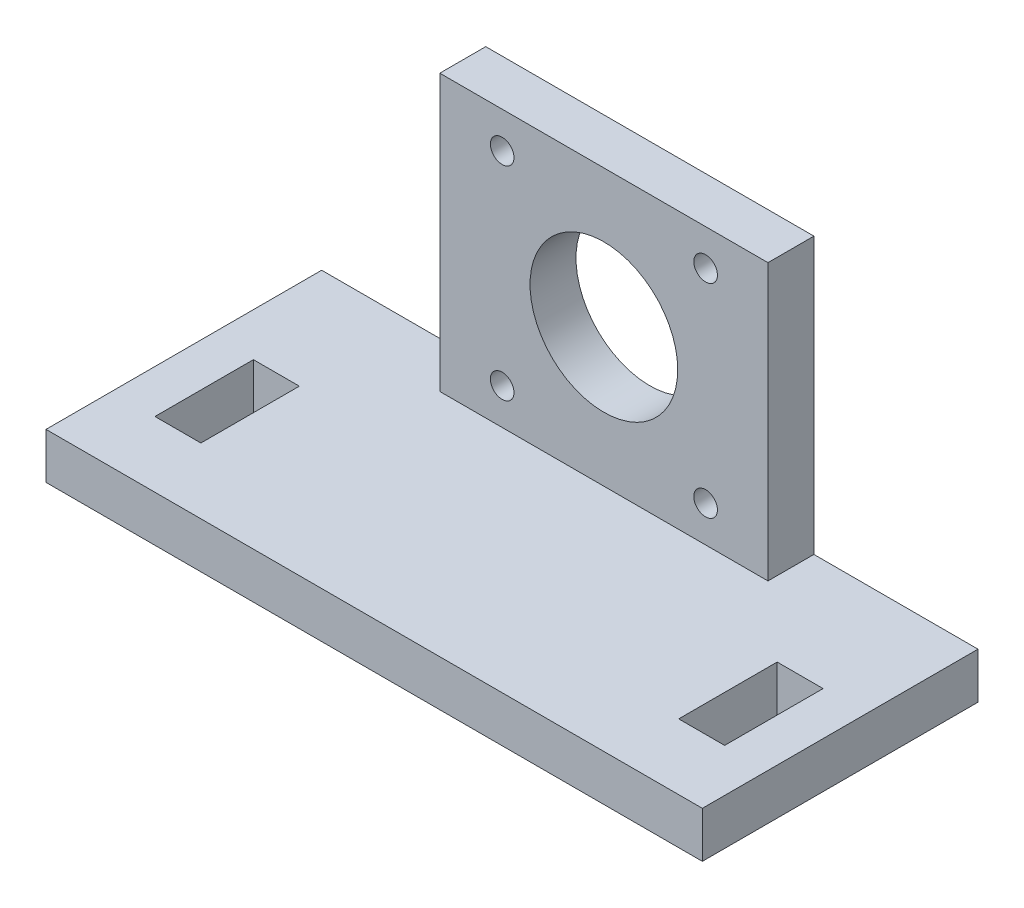
ISO-10303-21;
HEADER;
FILE_DESCRIPTION(('STEP AP214'),'2;1');
FILE_NAME('part.step','',(''),(''),'','','');
FILE_SCHEMA(('AUTOMOTIVE_DESIGN { 1 0 10303 214 1 1 1 1 }'));
ENDSEC;
DATA;
#1=APPLICATION_CONTEXT('core data for automotive mechanical design processes');
#2=APPLICATION_PROTOCOL_DEFINITION('international standard','automotive_design',2000,#1);
#3=PRODUCT_CONTEXT('',#1,'mechanical');
#4=PRODUCT('Part','Part','',(#3));
#5=PRODUCT_RELATED_PRODUCT_CATEGORY('part','',(#4));
#6=PRODUCT_DEFINITION_FORMATION('','',#4);
#7=PRODUCT_DEFINITION_CONTEXT('part definition',#1,'design');
#8=PRODUCT_DEFINITION('design','',#6,#7);
#9=PRODUCT_DEFINITION_SHAPE('','',#8);
#10=(LENGTH_UNIT() NAMED_UNIT(*) SI_UNIT(.MILLI.,.METRE.));
#11=(NAMED_UNIT(*) PLANE_ANGLE_UNIT() SI_UNIT($,.RADIAN.));
#12=(NAMED_UNIT(*) SI_UNIT($,.STERADIAN.) SOLID_ANGLE_UNIT());
#13=UNCERTAINTY_MEASURE_WITH_UNIT(LENGTH_MEASURE(1.E-05),#10,'distance_accuracy_value','');
#14=(GEOMETRIC_REPRESENTATION_CONTEXT(3) GLOBAL_UNCERTAINTY_ASSIGNED_CONTEXT((#13)) GLOBAL_UNIT_ASSIGNED_CONTEXT((#10,
#11,#12)) REPRESENTATION_CONTEXT('',''));
#15=CARTESIAN_POINT('',(0.,0.,0.));
#16=DIRECTION('',(0.,0.,1.));
#17=DIRECTION('',(1.,0.,0.));
#18=AXIS2_PLACEMENT_3D('',#15,#16,#17);
#19=CARTESIAN_POINT('',(-25.,49.,21.));
#20=DIRECTION('',(1.,0.,0.));
#21=DIRECTION('',(0.,0.,-1.));
#22=AXIS2_PLACEMENT_3D('',#19,#20,#21);
#23=PLANE('',#22);
#24=DIRECTION('',(0.,0.,-1.));
#25=VECTOR('',#24,1.);
#26=CARTESIAN_POINT('',(-25.,7.,21.));
#27=LINE('',#26,#25);
#28=CARTESIAN_POINT('',(-25.,7.,-14.));
#29=VERTEX_POINT('',#28);
#30=CARTESIAN_POINT('',(-25.,7.,-21.));
#31=VERTEX_POINT('',#30);
#32=EDGE_CURVE('E11',#29,#31,#27,.T.);
#33=ORIENTED_EDGE('',*,*,#32,.F.);
#34=DIRECTION('',(0.,1.,0.));
#35=VECTOR('',#34,1.);
#36=CARTESIAN_POINT('',(-25.,7.,-14.));
#37=LINE('',#36,#35);
#38=CARTESIAN_POINT('',(-25.,49.,-14.));
#39=VERTEX_POINT('',#38);
#40=EDGE_CURVE('E270',#29,#39,#37,.T.);
#41=ORIENTED_EDGE('',*,*,#40,.T.);
#42=DIRECTION('',(0.,0.,1.));
#43=VECTOR('',#42,1.);
#44=CARTESIAN_POINT('',(-25.,49.,21.));
#45=LINE('',#44,#43);
#46=CARTESIAN_POINT('',(-25.,49.,-21.));
#47=VERTEX_POINT('',#46);
#48=EDGE_CURVE('E320',#47,#39,#45,.T.);
#49=ORIENTED_EDGE('',*,*,#48,.F.);
#50=DIRECTION('',(0.,-1.,0.));
#51=VECTOR('',#50,1.);
#52=CARTESIAN_POINT('',(-25.,49.,-21.));
#53=LINE('',#52,#51);
#54=EDGE_CURVE('E263',#47,#31,#53,.T.);
#55=ORIENTED_EDGE('',*,*,#54,.T.);
#56=EDGE_LOOP('',(#33,#41,#49,#55));
#57=FACE_BOUND('',#56,.T.);
#58=ADVANCED_FACE('F32',(#57),#23,.F.);
#59=CARTESIAN_POINT('',(25.,49.,21.));
#60=DIRECTION('',(-1.,0.,0.));
#61=DIRECTION('',(0.,0.,1.));
#62=AXIS2_PLACEMENT_3D('',#59,#60,#61);
#63=PLANE('',#62);
#64=DIRECTION('',(0.,0.,1.));
#65=VECTOR('',#64,1.);
#66=CARTESIAN_POINT('',(25.,7.,21.));
#67=LINE('',#66,#65);
#68=CARTESIAN_POINT('',(25.,7.,-21.));
#69=VERTEX_POINT('',#68);
#70=CARTESIAN_POINT('',(25.,7.,-14.));
#71=VERTEX_POINT('',#70);
#72=EDGE_CURVE('E268',#69,#71,#67,.T.);
#73=ORIENTED_EDGE('',*,*,#72,.F.);
#74=DIRECTION('',(0.,-1.,0.));
#75=VECTOR('',#74,1.);
#76=CARTESIAN_POINT('',(25.,49.,-21.));
#77=LINE('',#76,#75);
#78=CARTESIAN_POINT('',(25.,49.,-21.));
#79=VERTEX_POINT('',#78);
#80=EDGE_CURVE('E41',#79,#69,#77,.T.);
#81=ORIENTED_EDGE('',*,*,#80,.F.);
#82=DIRECTION('',(0.,0.,-1.));
#83=VECTOR('',#82,1.);
#84=CARTESIAN_POINT('',(25.,49.,21.));
#85=LINE('',#84,#83);
#86=CARTESIAN_POINT('',(25.,49.,-14.));
#87=VERTEX_POINT('',#86);
#88=EDGE_CURVE('E316',#87,#79,#85,.T.);
#89=ORIENTED_EDGE('',*,*,#88,.F.);
#90=DIRECTION('',(0.,1.,0.));
#91=VECTOR('',#90,1.);
#92=CARTESIAN_POINT('',(25.,7.,-14.));
#93=LINE('',#92,#91);
#94=EDGE_CURVE('E273',#71,#87,#93,.T.);
#95=ORIENTED_EDGE('',*,*,#94,.F.);
#96=EDGE_LOOP('',(#73,#81,#89,#95));
#97=FACE_BOUND('',#96,.T.);
#98=ADVANCED_FACE('F34',(#97),#63,.F.);
#99=CARTESIAN_POINT('',(-25.,49.,-21.));
#100=DIRECTION('',(0.,0.,1.));
#101=DIRECTION('',(1.,0.,0.));
#102=AXIS2_PLACEMENT_3D('',#99,#100,#101);
#103=PLANE('',#102);
#104=CARTESIAN_POINT('',(15.5000000000003,12.5,-21.));
#105=DIRECTION('',(0.,0.,1.));
#106=DIRECTION('',(1.,0.,0.));
#107=AXIS2_PLACEMENT_3D('',#104,#105,#106);
#108=CIRCLE('',#107,1.8);
#109=CARTESIAN_POINT('',(17.3000000000003,12.5,-21.));
#110=VERTEX_POINT('',#109);
#111=EDGE_CURVE('E218',#110,#110,#108,.T.);
#112=ORIENTED_EDGE('',*,*,#111,.T.);
#113=EDGE_LOOP('',(#112));
#114=FACE_BOUND('',#113,.T.);
#115=CARTESIAN_POINT('',(-15.4999999999997,12.5,-21.));
#116=DIRECTION('',(0.,0.,1.));
#117=DIRECTION('',(1.,0.,0.));
#118=AXIS2_PLACEMENT_3D('',#115,#116,#117);
#119=CIRCLE('',#118,1.8);
#120=CARTESIAN_POINT('',(-13.6999999999997,12.5,-21.));
#121=VERTEX_POINT('',#120);
#122=EDGE_CURVE('E224',#121,#121,#119,.T.);
#123=ORIENTED_EDGE('',*,*,#122,.T.);
#124=EDGE_LOOP('',(#123));
#125=FACE_BOUND('',#124,.T.);
#126=CARTESIAN_POINT('',(15.5,43.5,-21.));
#127=DIRECTION('',(0.,0.,1.));
#128=DIRECTION('',(1.,0.,0.));
#129=AXIS2_PLACEMENT_3D('',#126,#127,#128);
#130=CIRCLE('',#129,1.8);
#131=CARTESIAN_POINT('',(17.3,43.5,-21.));
#132=VERTEX_POINT('',#131);
#133=EDGE_CURVE('E230',#132,#132,#130,.T.);
#134=ORIENTED_EDGE('',*,*,#133,.T.);
#135=EDGE_LOOP('',(#134));
#136=FACE_BOUND('',#135,.T.);
#137=CARTESIAN_POINT('',(-15.5,43.5,-21.));
#138=DIRECTION('',(0.,0.,1.));
#139=DIRECTION('',(1.,0.,0.));
#140=AXIS2_PLACEMENT_3D('',#137,#138,#139);
#141=CIRCLE('',#140,1.8);
#142=CARTESIAN_POINT('',(-13.7,43.5,-21.));
#143=VERTEX_POINT('',#142);
#144=EDGE_CURVE('E236',#143,#143,#141,.T.);
#145=ORIENTED_EDGE('',*,*,#144,.T.);
#146=EDGE_LOOP('',(#145));
#147=FACE_BOUND('',#146,.T.);
#148=CARTESIAN_POINT('',(0.,28.,-21.));
#149=DIRECTION('',(0.,0.,1.));
#150=DIRECTION('',(1.,0.,0.));
#151=AXIS2_PLACEMENT_3D('',#148,#149,#150);
#152=CIRCLE('',#151,11.25);
#153=CARTESIAN_POINT('',(11.25,28.,-21.));
#154=VERTEX_POINT('',#153);
#155=EDGE_CURVE('E242',#154,#154,#152,.T.);
#156=ORIENTED_EDGE('',*,*,#155,.T.);
#157=EDGE_LOOP('',(#156));
#158=FACE_BOUND('',#157,.T.);
#159=DIRECTION('',(-1.,0.,0.));
#160=VECTOR('',#159,1.);
#161=CARTESIAN_POINT('',(-25.,0.,-21.));
#162=LINE('',#161,#160);
#163=CARTESIAN_POINT('',(50.,0.,-21.));
#164=VERTEX_POINT('',#163);
#165=CARTESIAN_POINT('',(-50.,0.,-21.));
#166=VERTEX_POINT('',#165);
#167=EDGE_CURVE('E272',#164,#166,#162,.T.);
#168=ORIENTED_EDGE('',*,*,#167,.T.);
#169=DIRECTION('',(0.,-1.,0.));
#170=VECTOR('',#169,1.);
#171=CARTESIAN_POINT('',(-50.,7.,-21.));
#172=LINE('',#171,#170);
#173=CARTESIAN_POINT('',(-50.,7.,-21.));
#174=VERTEX_POINT('',#173);
#175=EDGE_CURVE('E250',#174,#166,#172,.T.);
#176=ORIENTED_EDGE('',*,*,#175,.F.);
#177=DIRECTION('',(1.,0.,0.));
#178=VECTOR('',#177,1.);
#179=CARTESIAN_POINT('',(-50.,7.,-21.));
#180=LINE('',#179,#178);
#181=EDGE_CURVE('E256',#174,#31,#180,.T.);
#182=ORIENTED_EDGE('',*,*,#181,.T.);
#183=ORIENTED_EDGE('',*,*,#54,.F.);
#184=DIRECTION('',(-1.,0.,0.));
#185=VECTOR('',#184,1.);
#186=CARTESIAN_POINT('',(-25.,49.,-21.));
#187=LINE('',#186,#185);
#188=EDGE_CURVE('E318',#79,#47,#187,.T.);
#189=ORIENTED_EDGE('',*,*,#188,.F.);
#190=ORIENTED_EDGE('',*,*,#80,.T.);
#191=DIRECTION('',(-1.,0.,0.));
#192=VECTOR('',#191,1.);
#193=CARTESIAN_POINT('',(50.,7.,-21.));
#194=LINE('',#193,#192);
#195=CARTESIAN_POINT('',(50.,7.,-21.));
#196=VERTEX_POINT('',#195);
#197=EDGE_CURVE('E294',#196,#69,#194,.T.);
#198=ORIENTED_EDGE('',*,*,#197,.F.);
#199=DIRECTION('',(0.,1.,0.));
#200=VECTOR('',#199,1.);
#201=CARTESIAN_POINT('',(50.,0.,-21.));
#202=LINE('',#201,#200);
#203=EDGE_CURVE('E304',#164,#196,#202,.T.);
#204=ORIENTED_EDGE('',*,*,#203,.F.);
#205=EDGE_LOOP('',(#168,#176,#182,#183,#189,#190,#198,#204));
#206=FACE_BOUND('',#205,.T.);
#207=ADVANCED_FACE('F335',(#114,#125,#136,#147,#158,#206),#103,.F.);
#208=CARTESIAN_POINT('',(-25.,49.,21.));
#209=DIRECTION('',(0.,0.,-1.));
#210=DIRECTION('',(-1.,0.,0.));
#211=AXIS2_PLACEMENT_3D('',#208,#209,#210);
#212=PLANE('',#211);
#213=DIRECTION('',(1.,0.,0.));
#214=VECTOR('',#213,1.);
#215=CARTESIAN_POINT('',(-25.,0.,21.));
#216=LINE('',#215,#214);
#217=CARTESIAN_POINT('',(-50.,0.,21.));
#218=VERTEX_POINT('',#217);
#219=CARTESIAN_POINT('',(50.,0.,21.));
#220=VERTEX_POINT('',#219);
#221=EDGE_CURVE('E278',#218,#220,#216,.T.);
#222=ORIENTED_EDGE('',*,*,#221,.T.);
#223=DIRECTION('',(0.,-1.,0.));
#224=VECTOR('',#223,1.);
#225=CARTESIAN_POINT('',(50.,0.,21.));
#226=LINE('',#225,#224);
#227=CARTESIAN_POINT('',(50.,7.,21.));
#228=VERTEX_POINT('',#227);
#229=EDGE_CURVE('E259',#228,#220,#226,.T.);
#230=ORIENTED_EDGE('',*,*,#229,.F.);
#231=DIRECTION('',(1.,0.,0.));
#232=VECTOR('',#231,1.);
#233=CARTESIAN_POINT('',(-25.,7.,21.));
#234=LINE('',#233,#232);
#235=CARTESIAN_POINT('',(-50.,7.,21.));
#236=VERTEX_POINT('',#235);
#237=EDGE_CURVE('E287',#236,#228,#234,.T.);
#238=ORIENTED_EDGE('',*,*,#237,.F.);
#239=DIRECTION('',(0.,1.,0.));
#240=VECTOR('',#239,1.);
#241=CARTESIAN_POINT('',(-50.,7.,21.));
#242=LINE('',#241,#240);
#243=EDGE_CURVE('E245',#218,#236,#242,.T.);
#244=ORIENTED_EDGE('',*,*,#243,.F.);
#245=EDGE_LOOP('',(#222,#230,#238,#244));
#246=FACE_BOUND('',#245,.T.);
#247=ADVANCED_FACE('F345',(#246),#212,.F.);
#248=CARTESIAN_POINT('',(0.,49.,0.));
#249=DIRECTION('',(0.,-1.,0.));
#250=DIRECTION('',(0.,0.,-1.));
#251=AXIS2_PLACEMENT_3D('',#248,#249,#250);
#252=PLANE('',#251);
#253=ORIENTED_EDGE('',*,*,#48,.T.);
#254=DIRECTION('',(-1.,0.,0.));
#255=VECTOR('',#254,1.);
#256=CARTESIAN_POINT('',(-25.,49.,-14.));
#257=LINE('',#256,#255);
#258=EDGE_CURVE('E295',#87,#39,#257,.T.);
#259=ORIENTED_EDGE('',*,*,#258,.F.);
#260=ORIENTED_EDGE('',*,*,#88,.T.);
#261=ORIENTED_EDGE('',*,*,#188,.T.);
#262=EDGE_LOOP('',(#253,#259,#260,#261));
#263=FACE_BOUND('',#262,.T.);
#264=ADVANCED_FACE('F371',(#263),#252,.F.);
#265=CARTESIAN_POINT('',(0.,0.,0.));
#266=DIRECTION('',(0.,-1.,0.));
#267=DIRECTION('',(0.,0.,-1.));
#268=AXIS2_PLACEMENT_3D('',#265,#266,#267);
#269=PLANE('',#268);
#270=DIRECTION('',(0.,0.,1.));
#271=VECTOR('',#270,1.);
#272=CARTESIAN_POINT('',(36.4,0.,11.));
#273=LINE('',#272,#271);
#274=CARTESIAN_POINT('',(36.4,0.,-4.));
#275=VERTEX_POINT('',#274);
#276=CARTESIAN_POINT('',(36.4,0.,11.));
#277=VERTEX_POINT('',#276);
#278=EDGE_CURVE('E149',#275,#277,#273,.T.);
#279=ORIENTED_EDGE('',*,*,#278,.T.);
#280=DIRECTION('',(1.,0.,0.));
#281=VECTOR('',#280,1.);
#282=CARTESIAN_POINT('',(36.4,0.,11.));
#283=LINE('',#282,#281);
#284=CARTESIAN_POINT('',(43.4,0.,11.));
#285=VERTEX_POINT('',#284);
#286=EDGE_CURVE('E158',#277,#285,#283,.T.);
#287=ORIENTED_EDGE('',*,*,#286,.T.);
#288=DIRECTION('',(0.,0.,-1.));
#289=VECTOR('',#288,1.);
#290=CARTESIAN_POINT('',(43.4,0.,11.));
#291=LINE('',#290,#289);
#292=CARTESIAN_POINT('',(43.4,0.,-4.));
#293=VERTEX_POINT('',#292);
#294=EDGE_CURVE('E49',#285,#293,#291,.T.);
#295=ORIENTED_EDGE('',*,*,#294,.T.);
#296=DIRECTION('',(-1.,0.,0.));
#297=VECTOR('',#296,1.);
#298=CARTESIAN_POINT('',(36.4,0.,-4.));
#299=LINE('',#298,#297);
#300=EDGE_CURVE('E155',#293,#275,#299,.T.);
#301=ORIENTED_EDGE('',*,*,#300,.T.);
#302=EDGE_LOOP('',(#279,#287,#295,#301));
#303=FACE_BOUND('',#302,.T.);
#304=DIRECTION('',(0.,0.,1.));
#305=VECTOR('',#304,1.);
#306=CARTESIAN_POINT('',(-43.4,0.,11.));
#307=LINE('',#306,#305);
#308=CARTESIAN_POINT('',(-43.4,0.,-4.));
#309=VERTEX_POINT('',#308);
#310=CARTESIAN_POINT('',(-43.4,0.,11.));
#311=VERTEX_POINT('',#310);
#312=EDGE_CURVE('E184',#309,#311,#307,.T.);
#313=ORIENTED_EDGE('',*,*,#312,.T.);
#314=DIRECTION('',(1.,0.,0.));
#315=VECTOR('',#314,1.);
#316=CARTESIAN_POINT('',(-43.4,0.,11.));
#317=LINE('',#316,#315);
#318=CARTESIAN_POINT('',(-36.4,0.,11.));
#319=VERTEX_POINT('',#318);
#320=EDGE_CURVE('E187',#311,#319,#317,.T.);
#321=ORIENTED_EDGE('',*,*,#320,.T.);
#322=DIRECTION('',(0.,0.,-1.));
#323=VECTOR('',#322,1.);
#324=CARTESIAN_POINT('',(-36.4,0.,11.));
#325=LINE('',#324,#323);
#326=CARTESIAN_POINT('',(-36.4,0.,-4.));
#327=VERTEX_POINT('',#326);
#328=EDGE_CURVE('E191',#319,#327,#325,.T.);
#329=ORIENTED_EDGE('',*,*,#328,.T.);
#330=DIRECTION('',(-1.,0.,0.));
#331=VECTOR('',#330,1.);
#332=CARTESIAN_POINT('',(-43.4,0.,-4.));
#333=LINE('',#332,#331);
#334=EDGE_CURVE('E194',#327,#309,#333,.T.);
#335=ORIENTED_EDGE('',*,*,#334,.T.);
#336=EDGE_LOOP('',(#313,#321,#329,#335));
#337=FACE_BOUND('',#336,.T.);
#338=ORIENTED_EDGE('',*,*,#167,.F.);
#339=DIRECTION('',(0.,0.,-1.));
#340=VECTOR('',#339,1.);
#341=CARTESIAN_POINT('',(50.,0.,21.));
#342=LINE('',#341,#340);
#343=EDGE_CURVE('E309',#220,#164,#342,.T.);
#344=ORIENTED_EDGE('',*,*,#343,.F.);
#345=ORIENTED_EDGE('',*,*,#221,.F.);
#346=DIRECTION('',(0.,0.,1.));
#347=VECTOR('',#346,1.);
#348=CARTESIAN_POINT('',(-50.,0.,21.));
#349=LINE('',#348,#347);
#350=EDGE_CURVE('E253',#166,#218,#349,.T.);
#351=ORIENTED_EDGE('',*,*,#350,.F.);
#352=EDGE_LOOP('',(#338,#344,#345,#351));
#353=FACE_BOUND('',#352,.T.);
#354=ADVANCED_FACE('F162',(#303,#337,#353),#269,.T.);
#355=CARTESIAN_POINT('',(-25.,7.,-14.));
#356=DIRECTION('',(0.,0.,-1.));
#357=DIRECTION('',(-1.,0.,0.));
#358=AXIS2_PLACEMENT_3D('',#355,#356,#357);
#359=PLANE('',#358);
#360=CARTESIAN_POINT('',(15.5000000000003,12.5,-14.));
#361=DIRECTION('',(0.,0.,1.));
#362=DIRECTION('',(1.,0.,0.));
#363=AXIS2_PLACEMENT_3D('',#360,#361,#362);
#364=CIRCLE('',#363,1.8);
#365=CARTESIAN_POINT('',(17.3000000000003,12.5,-14.));
#366=VERTEX_POINT('',#365);
#367=EDGE_CURVE('E209',#366,#366,#364,.T.);
#368=ORIENTED_EDGE('',*,*,#367,.F.);
#369=EDGE_LOOP('',(#368));
#370=FACE_BOUND('',#369,.T.);
#371=CARTESIAN_POINT('',(-15.4999999999997,12.5,-14.));
#372=DIRECTION('',(0.,0.,1.));
#373=DIRECTION('',(1.,0.,0.));
#374=AXIS2_PLACEMENT_3D('',#371,#372,#373);
#375=CIRCLE('',#374,1.8);
#376=CARTESIAN_POINT('',(-13.6999999999997,12.5,-14.));
#377=VERTEX_POINT('',#376);
#378=EDGE_CURVE('E221',#377,#377,#375,.T.);
#379=ORIENTED_EDGE('',*,*,#378,.F.);
#380=EDGE_LOOP('',(#379));
#381=FACE_BOUND('',#380,.T.);
#382=CARTESIAN_POINT('',(15.5,43.5,-14.));
#383=DIRECTION('',(0.,0.,1.));
#384=DIRECTION('',(1.,0.,0.));
#385=AXIS2_PLACEMENT_3D('',#382,#383,#384);
#386=CIRCLE('',#385,1.8);
#387=CARTESIAN_POINT('',(17.3,43.5,-14.));
#388=VERTEX_POINT('',#387);
#389=EDGE_CURVE('E227',#388,#388,#386,.T.);
#390=ORIENTED_EDGE('',*,*,#389,.F.);
#391=EDGE_LOOP('',(#390));
#392=FACE_BOUND('',#391,.T.);
#393=CARTESIAN_POINT('',(-15.5,43.5,-14.));
#394=DIRECTION('',(0.,0.,1.));
#395=DIRECTION('',(1.,0.,0.));
#396=AXIS2_PLACEMENT_3D('',#393,#394,#395);
#397=CIRCLE('',#396,1.8);
#398=CARTESIAN_POINT('',(-13.7,43.5,-14.));
#399=VERTEX_POINT('',#398);
#400=EDGE_CURVE('E233',#399,#399,#397,.T.);
#401=ORIENTED_EDGE('',*,*,#400,.F.);
#402=EDGE_LOOP('',(#401));
#403=FACE_BOUND('',#402,.T.);
#404=CARTESIAN_POINT('',(0.,28.,-14.));
#405=DIRECTION('',(0.,0.,1.));
#406=DIRECTION('',(1.,0.,0.));
#407=AXIS2_PLACEMENT_3D('',#404,#405,#406);
#408=CIRCLE('',#407,11.25);
#409=CARTESIAN_POINT('',(11.25,28.,-14.));
#410=VERTEX_POINT('',#409);
#411=EDGE_CURVE('E239',#410,#410,#408,.T.);
#412=ORIENTED_EDGE('',*,*,#411,.F.);
#413=EDGE_LOOP('',(#412));
#414=FACE_BOUND('',#413,.T.);
#415=ORIENTED_EDGE('',*,*,#258,.T.);
#416=ORIENTED_EDGE('',*,*,#40,.F.);
#417=DIRECTION('',(-1.,0.,0.));
#418=VECTOR('',#417,1.);
#419=CARTESIAN_POINT('',(-25.,7.,-14.));
#420=LINE('',#419,#418);
#421=EDGE_CURVE('E280',#71,#29,#420,.T.);
#422=ORIENTED_EDGE('',*,*,#421,.F.);
#423=ORIENTED_EDGE('',*,*,#94,.T.);
#424=EDGE_LOOP('',(#415,#416,#422,#423));
#425=FACE_BOUND('',#424,.T.);
#426=ADVANCED_FACE('F355',(#370,#381,#392,#403,#414,#425),#359,.F.);
#427=CARTESIAN_POINT('',(0.,7.,0.));
#428=DIRECTION('',(0.,-1.,0.));
#429=DIRECTION('',(0.,0.,-1.));
#430=AXIS2_PLACEMENT_3D('',#427,#428,#429);
#431=PLANE('',#430);
#432=DIRECTION('',(1.,0.,0.));
#433=VECTOR('',#432,1.);
#434=CARTESIAN_POINT('',(36.4,7.,11.));
#435=LINE('',#434,#433);
#436=CARTESIAN_POINT('',(36.4,7.,11.));
#437=VERTEX_POINT('',#436);
#438=CARTESIAN_POINT('',(43.4,7.,11.));
#439=VERTEX_POINT('',#438);
#440=EDGE_CURVE('E174',#437,#439,#435,.T.);
#441=ORIENTED_EDGE('',*,*,#440,.F.);
#442=DIRECTION('',(0.,0.,1.));
#443=VECTOR('',#442,1.);
#444=CARTESIAN_POINT('',(36.4,7.,11.));
#445=LINE('',#444,#443);
#446=CARTESIAN_POINT('',(36.4,7.,-4.));
#447=VERTEX_POINT('',#446);
#448=EDGE_CURVE('E57',#447,#437,#445,.T.);
#449=ORIENTED_EDGE('',*,*,#448,.F.);
#450=DIRECTION('',(-1.,0.,0.));
#451=VECTOR('',#450,1.);
#452=CARTESIAN_POINT('',(36.4,7.,-4.));
#453=LINE('',#452,#451);
#454=CARTESIAN_POINT('',(43.4,7.,-4.));
#455=VERTEX_POINT('',#454);
#456=EDGE_CURVE('E165',#455,#447,#453,.T.);
#457=ORIENTED_EDGE('',*,*,#456,.F.);
#458=DIRECTION('',(0.,0.,-1.));
#459=VECTOR('',#458,1.);
#460=CARTESIAN_POINT('',(43.4,7.,11.));
#461=LINE('',#460,#459);
#462=EDGE_CURVE('E168',#439,#455,#461,.T.);
#463=ORIENTED_EDGE('',*,*,#462,.F.);
#464=EDGE_LOOP('',(#441,#449,#457,#463));
#465=FACE_BOUND('',#464,.T.);
#466=DIRECTION('',(1.,0.,0.));
#467=VECTOR('',#466,1.);
#468=CARTESIAN_POINT('',(-43.4,7.,11.));
#469=LINE('',#468,#467);
#470=CARTESIAN_POINT('',(-43.4,7.,11.));
#471=VERTEX_POINT('',#470);
#472=CARTESIAN_POINT('',(-36.4,7.,11.));
#473=VERTEX_POINT('',#472);
#474=EDGE_CURVE('E199',#471,#473,#469,.T.);
#475=ORIENTED_EDGE('',*,*,#474,.F.);
#476=DIRECTION('',(0.,0.,1.));
#477=VECTOR('',#476,1.);
#478=CARTESIAN_POINT('',(-43.4,7.,11.));
#479=LINE('',#478,#477);
#480=CARTESIAN_POINT('',(-43.4,7.,-4.));
#481=VERTEX_POINT('',#480);
#482=EDGE_CURVE('E180',#481,#471,#479,.T.);
#483=ORIENTED_EDGE('',*,*,#482,.F.);
#484=DIRECTION('',(-1.,0.,0.));
#485=VECTOR('',#484,1.);
#486=CARTESIAN_POINT('',(-43.4,7.,-4.));
#487=LINE('',#486,#485);
#488=CARTESIAN_POINT('',(-36.4,7.,-4.));
#489=VERTEX_POINT('',#488);
#490=EDGE_CURVE('E188',#489,#481,#487,.T.);
#491=ORIENTED_EDGE('',*,*,#490,.F.);
#492=DIRECTION('',(0.,0.,-1.));
#493=VECTOR('',#492,1.);
#494=CARTESIAN_POINT('',(-36.4,7.,11.));
#495=LINE('',#494,#493);
#496=EDGE_CURVE('E202',#473,#489,#495,.T.);
#497=ORIENTED_EDGE('',*,*,#496,.F.);
#498=EDGE_LOOP('',(#475,#483,#491,#497));
#499=FACE_BOUND('',#498,.T.);
#500=ORIENTED_EDGE('',*,*,#421,.T.);
#501=ORIENTED_EDGE('',*,*,#32,.T.);
#502=ORIENTED_EDGE('',*,*,#181,.F.);
#503=DIRECTION('',(0.,0.,-1.));
#504=VECTOR('',#503,1.);
#505=CARTESIAN_POINT('',(-50.,7.,21.));
#506=LINE('',#505,#504);
#507=EDGE_CURVE('E248',#236,#174,#506,.T.);
#508=ORIENTED_EDGE('',*,*,#507,.F.);
#509=ORIENTED_EDGE('',*,*,#237,.T.);
#510=DIRECTION('',(0.,0.,1.));
#511=VECTOR('',#510,1.);
#512=CARTESIAN_POINT('',(50.,7.,21.));
#513=LINE('',#512,#511);
#514=EDGE_CURVE('E296',#196,#228,#513,.T.);
#515=ORIENTED_EDGE('',*,*,#514,.F.);
#516=ORIENTED_EDGE('',*,*,#197,.T.);
#517=ORIENTED_EDGE('',*,*,#72,.T.);
#518=EDGE_LOOP('',(#500,#501,#502,#508,#509,#515,#516,#517));
#519=FACE_BOUND('',#518,.T.);
#520=ADVANCED_FACE('F332',(#465,#499,#519),#431,.F.);
#521=CARTESIAN_POINT('',(50.,0.,0.));
#522=DIRECTION('',(-1.,0.,0.));
#523=DIRECTION('',(0.,0.,1.));
#524=AXIS2_PLACEMENT_3D('',#521,#522,#523);
#525=PLANE('',#524);
#526=ORIENTED_EDGE('',*,*,#229,.T.);
#527=ORIENTED_EDGE('',*,*,#343,.T.);
#528=ORIENTED_EDGE('',*,*,#203,.T.);
#529=ORIENTED_EDGE('',*,*,#514,.T.);
#530=EDGE_LOOP('',(#526,#527,#528,#529));
#531=FACE_BOUND('',#530,.T.);
#532=ADVANCED_FACE('F346',(#531),#525,.F.);
#533=CARTESIAN_POINT('',(-50.,0.,0.));
#534=DIRECTION('',(1.,0.,0.));
#535=DIRECTION('',(0.,0.,-1.));
#536=AXIS2_PLACEMENT_3D('',#533,#534,#535);
#537=PLANE('',#536);
#538=ORIENTED_EDGE('',*,*,#243,.T.);
#539=ORIENTED_EDGE('',*,*,#507,.T.);
#540=ORIENTED_EDGE('',*,*,#175,.T.);
#541=ORIENTED_EDGE('',*,*,#350,.T.);
#542=EDGE_LOOP('',(#538,#539,#540,#541));
#543=FACE_BOUND('',#542,.T.);
#544=ADVANCED_FACE('F339',(#543),#537,.F.);
#545=CARTESIAN_POINT('',(0.,28.,-21.00005));
#546=DIRECTION('',(0.,0.,1.));
#547=DIRECTION('',(1.,0.,0.));
#548=AXIS2_PLACEMENT_3D('',#545,#546,#547);
#549=CYLINDRICAL_SURFACE('',#548,11.25);
#550=ORIENTED_EDGE('',*,*,#411,.T.);
#551=EDGE_LOOP('',(#550));
#552=FACE_BOUND('',#551,.T.);
#553=ORIENTED_EDGE('',*,*,#155,.F.);
#554=EDGE_LOOP('',(#553));
#555=FACE_BOUND('',#554,.T.);
#556=ADVANCED_FACE('F353',(#552,#555),#549,.F.);
#557=CARTESIAN_POINT('',(-15.5,43.5,-21.00005));
#558=DIRECTION('',(0.,0.,1.));
#559=DIRECTION('',(1.,0.,0.));
#560=AXIS2_PLACEMENT_3D('',#557,#558,#559);
#561=CYLINDRICAL_SURFACE('',#560,1.8);
#562=ORIENTED_EDGE('',*,*,#400,.T.);
#563=EDGE_LOOP('',(#562));
#564=FACE_BOUND('',#563,.T.);
#565=ORIENTED_EDGE('',*,*,#144,.F.);
#566=EDGE_LOOP('',(#565));
#567=FACE_BOUND('',#566,.T.);
#568=ADVANCED_FACE('F383',(#564,#567),#561,.F.);
#569=CARTESIAN_POINT('',(15.5,43.5,-21.00005));
#570=DIRECTION('',(0.,0.,1.));
#571=DIRECTION('',(1.,0.,0.));
#572=AXIS2_PLACEMENT_3D('',#569,#570,#571);
#573=CYLINDRICAL_SURFACE('',#572,1.8);
#574=ORIENTED_EDGE('',*,*,#389,.T.);
#575=EDGE_LOOP('',(#574));
#576=FACE_BOUND('',#575,.T.);
#577=ORIENTED_EDGE('',*,*,#133,.F.);
#578=EDGE_LOOP('',(#577));
#579=FACE_BOUND('',#578,.T.);
#580=ADVANCED_FACE('F389',(#576,#579),#573,.F.);
#581=CARTESIAN_POINT('',(-15.4999999999997,12.5,-21.00005));
#582=DIRECTION('',(0.,0.,1.));
#583=DIRECTION('',(1.,0.,0.));
#584=AXIS2_PLACEMENT_3D('',#581,#582,#583);
#585=CYLINDRICAL_SURFACE('',#584,1.8);
#586=ORIENTED_EDGE('',*,*,#378,.T.);
#587=EDGE_LOOP('',(#586));
#588=FACE_BOUND('',#587,.T.);
#589=ORIENTED_EDGE('',*,*,#122,.F.);
#590=EDGE_LOOP('',(#589));
#591=FACE_BOUND('',#590,.T.);
#592=ADVANCED_FACE('F395',(#588,#591),#585,.F.);
#593=CARTESIAN_POINT('',(15.5000000000003,12.5,-21.00005));
#594=DIRECTION('',(0.,0.,1.));
#595=DIRECTION('',(1.,0.,0.));
#596=AXIS2_PLACEMENT_3D('',#593,#594,#595);
#597=CYLINDRICAL_SURFACE('',#596,1.8);
#598=ORIENTED_EDGE('',*,*,#367,.T.);
#599=EDGE_LOOP('',(#598));
#600=FACE_BOUND('',#599,.T.);
#601=ORIENTED_EDGE('',*,*,#111,.F.);
#602=EDGE_LOOP('',(#601));
#603=FACE_BOUND('',#602,.T.);
#604=ADVANCED_FACE('F399',(#600,#603),#597,.F.);
#605=CARTESIAN_POINT('',(-43.4,0.,11.));
#606=DIRECTION('',(-1.,0.,0.));
#607=DIRECTION('',(0.,0.,1.));
#608=AXIS2_PLACEMENT_3D('',#605,#606,#607);
#609=PLANE('',#608);
#610=ORIENTED_EDGE('',*,*,#482,.T.);
#611=DIRECTION('',(0.,1.,0.));
#612=VECTOR('',#611,1.);
#613=CARTESIAN_POINT('',(-43.4,0.,11.));
#614=LINE('',#613,#612);
#615=EDGE_CURVE('E197',#311,#471,#614,.T.);
#616=ORIENTED_EDGE('',*,*,#615,.F.);
#617=ORIENTED_EDGE('',*,*,#312,.F.);
#618=DIRECTION('',(0.,1.,0.));
#619=VECTOR('',#618,1.);
#620=CARTESIAN_POINT('',(-43.4,0.,-4.));
#621=LINE('',#620,#619);
#622=EDGE_CURVE('E207',#309,#481,#621,.T.);
#623=ORIENTED_EDGE('',*,*,#622,.T.);
#624=EDGE_LOOP('',(#610,#616,#617,#623));
#625=FACE_BOUND('',#624,.T.);
#626=ADVANCED_FACE('F403',(#625),#609,.F.);
#627=CARTESIAN_POINT('',(-43.4,0.,-4.));
#628=DIRECTION('',(0.,0.,-1.));
#629=DIRECTION('',(-1.,0.,0.));
#630=AXIS2_PLACEMENT_3D('',#627,#628,#629);
#631=PLANE('',#630);
#632=ORIENTED_EDGE('',*,*,#490,.T.);
#633=ORIENTED_EDGE('',*,*,#622,.F.);
#634=ORIENTED_EDGE('',*,*,#334,.F.);
#635=DIRECTION('',(0.,1.,0.));
#636=VECTOR('',#635,1.);
#637=CARTESIAN_POINT('',(-36.4,0.,-4.));
#638=LINE('',#637,#636);
#639=EDGE_CURVE('E210',#327,#489,#638,.T.);
#640=ORIENTED_EDGE('',*,*,#639,.T.);
#641=EDGE_LOOP('',(#632,#633,#634,#640));
#642=FACE_BOUND('',#641,.T.);
#643=ADVANCED_FACE('F407',(#642),#631,.F.);
#644=CARTESIAN_POINT('',(-36.4,0.,11.));
#645=DIRECTION('',(1.,0.,0.));
#646=DIRECTION('',(0.,0.,-1.));
#647=AXIS2_PLACEMENT_3D('',#644,#645,#646);
#648=PLANE('',#647);
#649=ORIENTED_EDGE('',*,*,#496,.T.);
#650=ORIENTED_EDGE('',*,*,#639,.F.);
#651=ORIENTED_EDGE('',*,*,#328,.F.);
#652=DIRECTION('',(0.,1.,0.));
#653=VECTOR('',#652,1.);
#654=CARTESIAN_POINT('',(-36.4,0.,11.));
#655=LINE('',#654,#653);
#656=EDGE_CURVE('E212',#319,#473,#655,.T.);
#657=ORIENTED_EDGE('',*,*,#656,.T.);
#658=EDGE_LOOP('',(#649,#650,#651,#657));
#659=FACE_BOUND('',#658,.T.);
#660=ADVANCED_FACE('F412',(#659),#648,.F.);
#661=CARTESIAN_POINT('',(-43.4,0.,11.));
#662=DIRECTION('',(0.,0.,1.));
#663=DIRECTION('',(1.,0.,0.));
#664=AXIS2_PLACEMENT_3D('',#661,#662,#663);
#665=PLANE('',#664);
#666=ORIENTED_EDGE('',*,*,#474,.T.);
#667=ORIENTED_EDGE('',*,*,#656,.F.);
#668=ORIENTED_EDGE('',*,*,#320,.F.);
#669=ORIENTED_EDGE('',*,*,#615,.T.);
#670=EDGE_LOOP('',(#666,#667,#668,#669));
#671=FACE_BOUND('',#670,.T.);
#672=ADVANCED_FACE('F409',(#671),#665,.F.);
#673=CARTESIAN_POINT('',(36.4,0.,11.));
#674=DIRECTION('',(-1.,0.,0.));
#675=DIRECTION('',(0.,0.,1.));
#676=AXIS2_PLACEMENT_3D('',#673,#674,#675);
#677=PLANE('',#676);
#678=ORIENTED_EDGE('',*,*,#448,.T.);
#679=DIRECTION('',(0.,1.,0.));
#680=VECTOR('',#679,1.);
#681=CARTESIAN_POINT('',(36.4,0.,11.));
#682=LINE('',#681,#680);
#683=EDGE_CURVE('E145',#277,#437,#682,.T.);
#684=ORIENTED_EDGE('',*,*,#683,.F.);
#685=ORIENTED_EDGE('',*,*,#278,.F.);
#686=DIRECTION('',(0.,1.,0.));
#687=VECTOR('',#686,1.);
#688=CARTESIAN_POINT('',(36.4,0.,-4.));
#689=LINE('',#688,#687);
#690=EDGE_CURVE('E178',#275,#447,#689,.T.);
#691=ORIENTED_EDGE('',*,*,#690,.T.);
#692=EDGE_LOOP('',(#678,#684,#685,#691));
#693=FACE_BOUND('',#692,.T.);
#694=ADVANCED_FACE('F147',(#693),#677,.F.);
#695=CARTESIAN_POINT('',(36.4,0.,-4.));
#696=DIRECTION('',(0.,0.,-1.));
#697=DIRECTION('',(-1.,0.,0.));
#698=AXIS2_PLACEMENT_3D('',#695,#696,#697);
#699=PLANE('',#698);
#700=ORIENTED_EDGE('',*,*,#456,.T.);
#701=ORIENTED_EDGE('',*,*,#690,.F.);
#702=ORIENTED_EDGE('',*,*,#300,.F.);
#703=DIRECTION('',(0.,1.,0.));
#704=VECTOR('',#703,1.);
#705=CARTESIAN_POINT('',(43.4,0.,-4.));
#706=LINE('',#705,#704);
#707=EDGE_CURVE('E181',#293,#455,#706,.T.);
#708=ORIENTED_EDGE('',*,*,#707,.T.);
#709=EDGE_LOOP('',(#700,#701,#702,#708));
#710=FACE_BOUND('',#709,.T.);
#711=ADVANCED_FACE('F422',(#710),#699,.F.);
#712=CARTESIAN_POINT('',(43.4,0.,11.));
#713=DIRECTION('',(1.,0.,0.));
#714=DIRECTION('',(0.,0.,-1.));
#715=AXIS2_PLACEMENT_3D('',#712,#713,#714);
#716=PLANE('',#715);
#717=ORIENTED_EDGE('',*,*,#462,.T.);
#718=ORIENTED_EDGE('',*,*,#707,.F.);
#719=ORIENTED_EDGE('',*,*,#294,.F.);
#720=DIRECTION('',(0.,1.,0.));
#721=VECTOR('',#720,1.);
#722=CARTESIAN_POINT('',(43.4,0.,11.));
#723=LINE('',#722,#721);
#724=EDGE_CURVE('E154',#285,#439,#723,.T.);
#725=ORIENTED_EDGE('',*,*,#724,.T.);
#726=EDGE_LOOP('',(#717,#718,#719,#725));
#727=FACE_BOUND('',#726,.T.);
#728=ADVANCED_FACE('F425',(#727),#716,.F.);
#729=CARTESIAN_POINT('',(36.4,0.,11.));
#730=DIRECTION('',(0.,0.,1.));
#731=DIRECTION('',(1.,0.,0.));
#732=AXIS2_PLACEMENT_3D('',#729,#730,#731);
#733=PLANE('',#732);
#734=ORIENTED_EDGE('',*,*,#440,.T.);
#735=ORIENTED_EDGE('',*,*,#724,.F.);
#736=ORIENTED_EDGE('',*,*,#286,.F.);
#737=ORIENTED_EDGE('',*,*,#683,.T.);
#738=EDGE_LOOP('',(#734,#735,#736,#737));
#739=FACE_BOUND('',#738,.T.);
#740=ADVANCED_FACE('F159',(#739),#733,.F.);
#741=CLOSED_SHELL('',(#58,#98,#207,#247,#264,#354,#426,#520,#532,#544,#556,#568,#580,#592,#604,
#626,#643,#660,#672,#694,#711,#728,#740));
#742=MANIFOLD_SOLID_BREP('B2',#741);
#743=ADVANCED_BREP_SHAPE_REPRESENTATION('',(#18,#742),#14);
#744=SHAPE_DEFINITION_REPRESENTATION(#9,#743);
ENDSEC;
END-ISO-10303-21;
